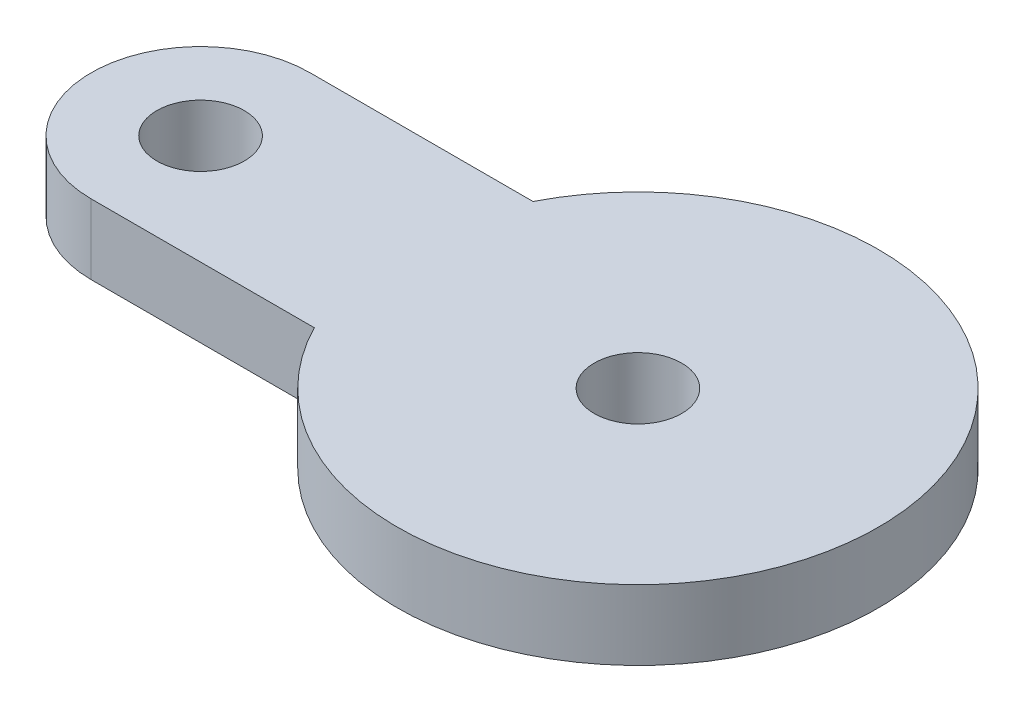
ISO-10303-21;
HEADER;
FILE_DESCRIPTION(('STEP AP214'),'2;1');
FILE_NAME('part.step','',(''),(''),'','','');
FILE_SCHEMA(('AUTOMOTIVE_DESIGN { 1 0 10303 214 1 1 1 1 }'));
ENDSEC;
DATA;
#1=APPLICATION_CONTEXT('core data for automotive mechanical design processes');
#2=APPLICATION_PROTOCOL_DEFINITION('international standard','automotive_design',2000,#1);
#3=PRODUCT_CONTEXT('',#1,'mechanical');
#4=PRODUCT('Part','Part','',(#3));
#5=PRODUCT_RELATED_PRODUCT_CATEGORY('part','',(#4));
#6=PRODUCT_DEFINITION_FORMATION('','',#4);
#7=PRODUCT_DEFINITION_CONTEXT('part definition',#1,'design');
#8=PRODUCT_DEFINITION('design','',#6,#7);
#9=PRODUCT_DEFINITION_SHAPE('','',#8);
#10=(LENGTH_UNIT() NAMED_UNIT(*) SI_UNIT(.MILLI.,.METRE.));
#11=(NAMED_UNIT(*) PLANE_ANGLE_UNIT() SI_UNIT($,.RADIAN.));
#12=(NAMED_UNIT(*) SI_UNIT($,.STERADIAN.) SOLID_ANGLE_UNIT());
#13=UNCERTAINTY_MEASURE_WITH_UNIT(LENGTH_MEASURE(1.E-05),#10,'distance_accuracy_value','');
#14=(GEOMETRIC_REPRESENTATION_CONTEXT(3) GLOBAL_UNCERTAINTY_ASSIGNED_CONTEXT((#13)) GLOBAL_UNIT_ASSIGNED_CONTEXT((#10,
#11,#12)) REPRESENTATION_CONTEXT('',''));
#15=CARTESIAN_POINT('',(0.,0.,0.));
#16=DIRECTION('',(0.,0.,1.));
#17=DIRECTION('',(1.,0.,0.));
#18=AXIS2_PLACEMENT_3D('',#15,#16,#17);
#19=CARTESIAN_POINT('',(2.5,0.,0.));
#20=DIRECTION('',(0.,-1.,0.));
#21=DIRECTION('',(0.,0.,-1.));
#22=AXIS2_PLACEMENT_3D('',#19,#20,#21);
#23=PLANE('',#22);
#24=CARTESIAN_POINT('',(-2.5,0.,0.));
#25=DIRECTION('',(0.,-1.,0.));
#26=DIRECTION('',(0.,0.,-1.));
#27=AXIS2_PLACEMENT_3D('',#24,#25,#26);
#28=CIRCLE('',#27,0.5);
#29=CARTESIAN_POINT('',(-2.5,0.,-0.5));
#30=VERTEX_POINT('',#29);
#31=EDGE_CURVE('E90',#30,#30,#28,.F.);
#32=ORIENTED_EDGE('',*,*,#31,.T.);
#33=EDGE_LOOP('',(#32));
#34=FACE_BOUND('',#33,.T.);
#35=DIRECTION('',(1.,0.,0.));
#36=VECTOR('',#35,1.);
#37=CARTESIAN_POINT('',(-2.50000001237224,0.,-1.25));
#38=LINE('',#37,#36);
#39=CARTESIAN_POINT('',(-2.50000000618612,0.,-1.25));
#40=VERTEX_POINT('',#39);
#41=CARTESIAN_POINT('',(0.0505102572168218,0.,-1.25));
#42=VERTEX_POINT('',#41);
#43=EDGE_CURVE('E78',#40,#42,#38,.T.);
#44=ORIENTED_EDGE('',*,*,#43,.T.);
#45=CARTESIAN_POINT('',(2.5,0.,0.));
#46=DIRECTION('',(0.,-1.,0.));
#47=DIRECTION('',(0.,0.,-1.));
#48=AXIS2_PLACEMENT_3D('',#45,#46,#47);
#49=CIRCLE('',#48,2.75);
#50=CARTESIAN_POINT('',(0.050510257216822,0.,1.25));
#51=VERTEX_POINT('',#50);
#52=EDGE_CURVE('E68',#51,#42,#49,.F.);
#53=ORIENTED_EDGE('',*,*,#52,.F.);
#54=DIRECTION('',(-1.,0.,0.));
#55=VECTOR('',#54,1.);
#56=CARTESIAN_POINT('',(0.0505102572168222,0.,1.25));
#57=LINE('',#56,#55);
#58=CARTESIAN_POINT('',(-2.50000000618612,0.,1.25));
#59=VERTEX_POINT('',#58);
#60=EDGE_CURVE('E65',#51,#59,#57,.T.);
#61=ORIENTED_EDGE('',*,*,#60,.T.);
#62=CARTESIAN_POINT('',(-2.5,0.,0.));
#63=DIRECTION('',(0.,-1.,0.));
#64=DIRECTION('',(0.,0.,-1.));
#65=AXIS2_PLACEMENT_3D('',#62,#63,#64);
#66=CIRCLE('',#65,1.25);
#67=EDGE_CURVE('E55',#40,#59,#66,.F.);
#68=ORIENTED_EDGE('',*,*,#67,.F.);
#69=EDGE_LOOP('',(#44,#53,#61,#68));
#70=FACE_BOUND('',#69,.T.);
#71=CARTESIAN_POINT('',(2.5,0.,0.));
#72=DIRECTION('',(0.,-1.,0.));
#73=DIRECTION('',(0.,0.,-1.));
#74=AXIS2_PLACEMENT_3D('',#71,#72,#73);
#75=CIRCLE('',#74,0.5);
#76=CARTESIAN_POINT('',(2.5,0.,-0.500000000000001));
#77=VERTEX_POINT('',#76);
#78=EDGE_CURVE('E20',#77,#77,#75,.F.);
#79=ORIENTED_EDGE('',*,*,#78,.T.);
#80=EDGE_LOOP('',(#79));
#81=FACE_BOUND('',#80,.T.);
#82=ADVANCED_FACE('F17',(#34,#70,#81),#23,.T.);
#83=CARTESIAN_POINT('',(2.5,0.8,0.));
#84=DIRECTION('',(0.,-1.,0.));
#85=DIRECTION('',(0.,0.,-1.));
#86=AXIS2_PLACEMENT_3D('',#83,#84,#85);
#87=CYLINDRICAL_SURFACE('',#86,0.5);
#88=ORIENTED_EDGE('',*,*,#78,.F.);
#89=EDGE_LOOP('',(#88));
#90=FACE_BOUND('',#89,.T.);
#91=CARTESIAN_POINT('',(2.5,0.8,0.));
#92=DIRECTION('',(0.,-1.,0.));
#93=DIRECTION('',(0.,0.,-1.));
#94=AXIS2_PLACEMENT_3D('',#91,#92,#93);
#95=CIRCLE('',#94,0.5);
#96=CARTESIAN_POINT('',(2.5,0.8,-0.500000000000001));
#97=VERTEX_POINT('',#96);
#98=EDGE_CURVE('E87',#97,#97,#95,.F.);
#99=ORIENTED_EDGE('',*,*,#98,.T.);
#100=EDGE_LOOP('',(#99));
#101=FACE_BOUND('',#100,.T.);
#102=ADVANCED_FACE('F159',(#90,#101),#87,.F.);
#103=CARTESIAN_POINT('',(0.0505102572168222,0.8,1.25));
#104=DIRECTION('',(0.,0.,-1.));
#105=DIRECTION('',(-1.,0.,0.));
#106=AXIS2_PLACEMENT_3D('',#103,#104,#105);
#107=PLANE('',#106);
#108=DIRECTION('',(0.,-1.,0.));
#109=VECTOR('',#108,1.);
#110=CARTESIAN_POINT('',(0.0505102572168222,0.8,1.25));
#111=LINE('',#110,#109);
#112=CARTESIAN_POINT('',(0.0505102572168222,0.8,1.25));
#113=VERTEX_POINT('',#112);
#114=EDGE_CURVE('E93',#113,#51,#111,.T.);
#115=ORIENTED_EDGE('',*,*,#114,.F.);
#116=DIRECTION('',(1.,0.,0.));
#117=VECTOR('',#116,1.);
#118=CARTESIAN_POINT('',(2.5,0.8,1.25));
#119=LINE('',#118,#117);
#120=CARTESIAN_POINT('',(-2.50000000618612,0.8,1.25));
#121=VERTEX_POINT('',#120);
#122=EDGE_CURVE('E76',#113,#121,#119,.F.);
#123=ORIENTED_EDGE('',*,*,#122,.T.);
#124=DIRECTION('',(0.,-1.,0.));
#125=VECTOR('',#124,1.);
#126=CARTESIAN_POINT('',(-2.50000001237224,0.8,1.25));
#127=LINE('',#126,#125);
#128=EDGE_CURVE('E62',#59,#121,#127,.F.);
#129=ORIENTED_EDGE('',*,*,#128,.F.);
#130=ORIENTED_EDGE('',*,*,#60,.F.);
#131=EDGE_LOOP('',(#115,#123,#129,#130));
#132=FACE_BOUND('',#131,.T.);
#133=ADVANCED_FACE('F74',(#132),#107,.F.);
#134=CARTESIAN_POINT('',(-2.5,0.8,0.));
#135=DIRECTION('',(0.,-1.,0.));
#136=DIRECTION('',(0.,0.,-1.));
#137=AXIS2_PLACEMENT_3D('',#134,#135,#136);
#138=CYLINDRICAL_SURFACE('',#137,1.25);
#139=CARTESIAN_POINT('',(-2.5,0.8,0.));
#140=DIRECTION('',(0.,-1.,0.));
#141=DIRECTION('',(0.,0.,-1.));
#142=AXIS2_PLACEMENT_3D('',#139,#140,#141);
#143=CIRCLE('',#142,1.25);
#144=CARTESIAN_POINT('',(-2.50000000618612,0.8,-1.25));
#145=VERTEX_POINT('',#144);
#146=EDGE_CURVE('E85',#121,#145,#143,.T.);
#147=ORIENTED_EDGE('',*,*,#146,.T.);
#148=DIRECTION('',(0.,1.,0.));
#149=VECTOR('',#148,1.);
#150=CARTESIAN_POINT('',(-2.50000001237224,0.8,-1.25));
#151=LINE('',#150,#149);
#152=EDGE_CURVE('E64',#145,#40,#151,.F.);
#153=ORIENTED_EDGE('',*,*,#152,.T.);
#154=ORIENTED_EDGE('',*,*,#67,.T.);
#155=ORIENTED_EDGE('',*,*,#128,.T.);
#156=EDGE_LOOP('',(#147,#153,#154,#155));
#157=FACE_BOUND('',#156,.T.);
#158=ADVANCED_FACE('F60',(#157),#138,.T.);
#159=CARTESIAN_POINT('',(-2.50000001237224,0.8,-1.25));
#160=DIRECTION('',(0.,0.,1.));
#161=DIRECTION('',(1.,0.,0.));
#162=AXIS2_PLACEMENT_3D('',#159,#160,#161);
#163=PLANE('',#162);
#164=ORIENTED_EDGE('',*,*,#152,.F.);
#165=DIRECTION('',(1.,0.,0.));
#166=VECTOR('',#165,1.);
#167=CARTESIAN_POINT('',(2.5,0.8,-1.25));
#168=LINE('',#167,#166);
#169=CARTESIAN_POINT('',(0.0505102572168215,0.8,-1.25));
#170=VERTEX_POINT('',#169);
#171=EDGE_CURVE('E84',#145,#170,#168,.T.);
#172=ORIENTED_EDGE('',*,*,#171,.T.);
#173=DIRECTION('',(0.,-1.,0.));
#174=VECTOR('',#173,1.);
#175=CARTESIAN_POINT('',(0.0505102572168213,0.8,-1.25));
#176=LINE('',#175,#174);
#177=EDGE_CURVE('E35',#42,#170,#176,.F.);
#178=ORIENTED_EDGE('',*,*,#177,.F.);
#179=ORIENTED_EDGE('',*,*,#43,.F.);
#180=EDGE_LOOP('',(#164,#172,#178,#179));
#181=FACE_BOUND('',#180,.T.);
#182=ADVANCED_FACE('F100',(#181),#163,.F.);
#183=CARTESIAN_POINT('',(2.5,0.8,0.));
#184=DIRECTION('',(0.,-1.,0.));
#185=DIRECTION('',(0.,0.,-1.));
#186=AXIS2_PLACEMENT_3D('',#183,#184,#185);
#187=CYLINDRICAL_SURFACE('',#186,2.75);
#188=ORIENTED_EDGE('',*,*,#114,.T.);
#189=ORIENTED_EDGE('',*,*,#52,.T.);
#190=ORIENTED_EDGE('',*,*,#177,.T.);
#191=CARTESIAN_POINT('',(2.5,0.8,0.));
#192=DIRECTION('',(0.,-1.,0.));
#193=DIRECTION('',(0.,0.,-1.));
#194=AXIS2_PLACEMENT_3D('',#191,#192,#193);
#195=CIRCLE('',#194,2.75);
#196=EDGE_CURVE('E26',#170,#113,#195,.T.);
#197=ORIENTED_EDGE('',*,*,#196,.T.);
#198=EDGE_LOOP('',(#188,#189,#190,#197));
#199=FACE_BOUND('',#198,.T.);
#200=ADVANCED_FACE('F104',(#199),#187,.T.);
#201=CARTESIAN_POINT('',(-2.5,0.8,0.));
#202=DIRECTION('',(0.,-1.,0.));
#203=DIRECTION('',(0.,0.,-1.));
#204=AXIS2_PLACEMENT_3D('',#201,#202,#203);
#205=CYLINDRICAL_SURFACE('',#204,0.5);
#206=ORIENTED_EDGE('',*,*,#31,.F.);
#207=EDGE_LOOP('',(#206));
#208=FACE_BOUND('',#207,.T.);
#209=CARTESIAN_POINT('',(-2.5,0.8,0.));
#210=DIRECTION('',(0.,-1.,0.));
#211=DIRECTION('',(0.,0.,-1.));
#212=AXIS2_PLACEMENT_3D('',#209,#210,#211);
#213=CIRCLE('',#212,0.5);
#214=CARTESIAN_POINT('',(-2.5,0.8,-0.5));
#215=VERTEX_POINT('',#214);
#216=EDGE_CURVE('E11',#215,#215,#213,.F.);
#217=ORIENTED_EDGE('',*,*,#216,.T.);
#218=EDGE_LOOP('',(#217));
#219=FACE_BOUND('',#218,.T.);
#220=ADVANCED_FACE('F106',(#208,#219),#205,.F.);
#221=CARTESIAN_POINT('',(2.5,0.8,0.));
#222=DIRECTION('',(0.,-1.,0.));
#223=DIRECTION('',(0.,0.,-1.));
#224=AXIS2_PLACEMENT_3D('',#221,#222,#223);
#225=PLANE('',#224);
#226=ORIENTED_EDGE('',*,*,#216,.F.);
#227=EDGE_LOOP('',(#226));
#228=FACE_BOUND('',#227,.T.);
#229=ORIENTED_EDGE('',*,*,#122,.F.);
#230=ORIENTED_EDGE('',*,*,#196,.F.);
#231=ORIENTED_EDGE('',*,*,#171,.F.);
#232=ORIENTED_EDGE('',*,*,#146,.F.);
#233=EDGE_LOOP('',(#229,#230,#231,#232));
#234=FACE_BOUND('',#233,.T.);
#235=ORIENTED_EDGE('',*,*,#98,.F.);
#236=EDGE_LOOP('',(#235));
#237=FACE_BOUND('',#236,.T.);
#238=ADVANCED_FACE('F102',(#228,#234,#237),#225,.F.);
#239=CLOSED_SHELL('',(#82,#102,#133,#158,#182,#200,#220,#238));
#240=MANIFOLD_SOLID_BREP('B1',#239);
#241=ADVANCED_BREP_SHAPE_REPRESENTATION('',(#18,#240),#14);
#242=SHAPE_DEFINITION_REPRESENTATION(#9,#241);
ENDSEC;
END-ISO-10303-21;
